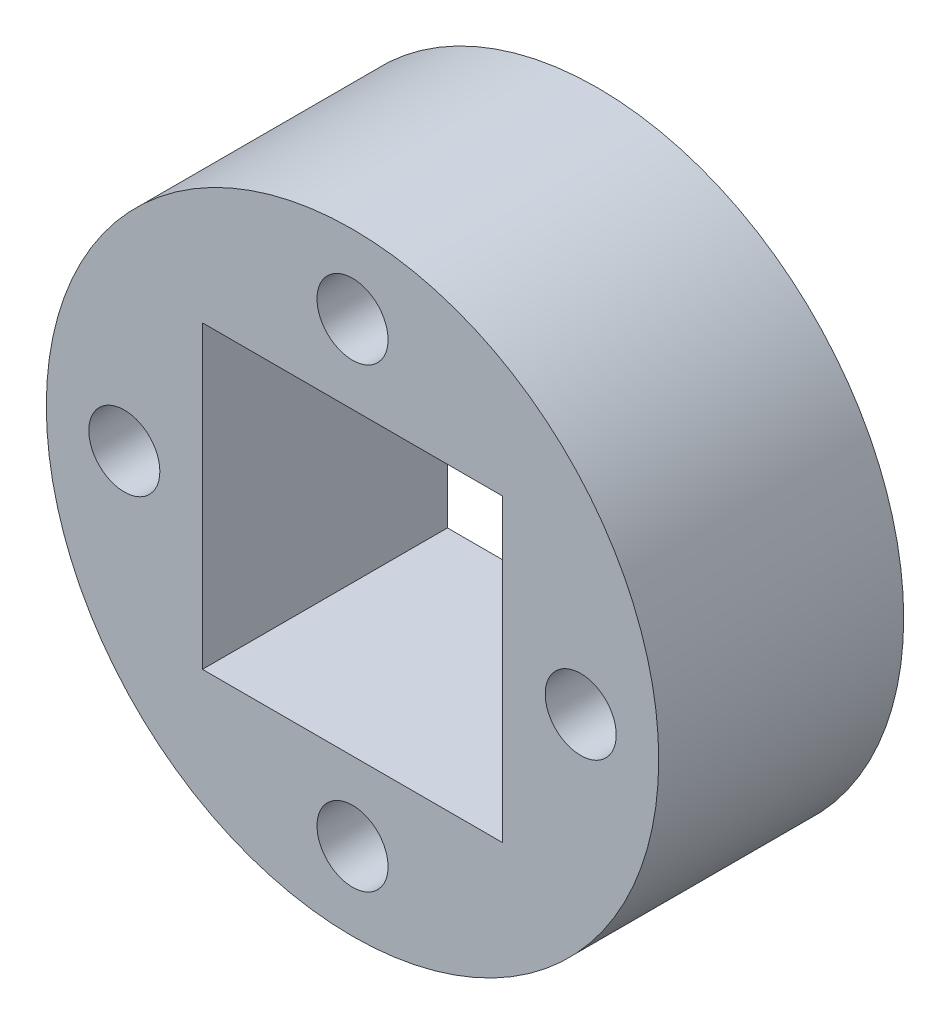
ISO-10303-21;
HEADER;
FILE_DESCRIPTION(('STEP AP214'),'2;1');
FILE_NAME('part.step','',(''),(''),'','','');
FILE_SCHEMA(('AUTOMOTIVE_DESIGN { 1 0 10303 214 1 1 1 1 }'));
ENDSEC;
DATA;
#1=APPLICATION_CONTEXT('core data for automotive mechanical design processes');
#2=APPLICATION_PROTOCOL_DEFINITION('international standard','automotive_design',2000,#1);
#3=PRODUCT_CONTEXT('',#1,'mechanical');
#4=PRODUCT('Part','Part','',(#3));
#5=PRODUCT_RELATED_PRODUCT_CATEGORY('part','',(#4));
#6=PRODUCT_DEFINITION_FORMATION('','',#4);
#7=PRODUCT_DEFINITION_CONTEXT('part definition',#1,'design');
#8=PRODUCT_DEFINITION('design','',#6,#7);
#9=PRODUCT_DEFINITION_SHAPE('','',#8);
#10=(LENGTH_UNIT() NAMED_UNIT(*) SI_UNIT(.MILLI.,.METRE.));
#11=(NAMED_UNIT(*) PLANE_ANGLE_UNIT() SI_UNIT($,.RADIAN.));
#12=(NAMED_UNIT(*) SI_UNIT($,.STERADIAN.) SOLID_ANGLE_UNIT());
#13=UNCERTAINTY_MEASURE_WITH_UNIT(LENGTH_MEASURE(1.E-05),#10,'distance_accuracy_value','');
#14=(GEOMETRIC_REPRESENTATION_CONTEXT(3) GLOBAL_UNCERTAINTY_ASSIGNED_CONTEXT((#13)) GLOBAL_UNIT_ASSIGNED_CONTEXT((#10,
#11,#12)) REPRESENTATION_CONTEXT('',''));
#15=CARTESIAN_POINT('',(0.,0.,0.));
#16=DIRECTION('',(0.,0.,1.));
#17=DIRECTION('',(1.,0.,0.));
#18=AXIS2_PLACEMENT_3D('',#15,#16,#17);
#19=CARTESIAN_POINT('',(0.,0.,-5.));
#20=DIRECTION('',(0.,0.,1.));
#21=DIRECTION('',(-1.,0.,0.));
#22=AXIS2_PLACEMENT_3D('',#19,#20,#21);
#23=CYLINDRICAL_SURFACE('',#22,12.5);
#24=CARTESIAN_POINT('',(0.,0.,-5.));
#25=DIRECTION('',(0.,0.,1.));
#26=DIRECTION('',(1.,0.,0.));
#27=AXIS2_PLACEMENT_3D('',#24,#25,#26);
#28=CIRCLE('',#27,12.5);
#29=CARTESIAN_POINT('',(12.5,0.,-5.));
#30=VERTEX_POINT('',#29);
#31=EDGE_CURVE('E11',#30,#30,#28,.T.);
#32=ORIENTED_EDGE('',*,*,#31,.T.);
#33=EDGE_LOOP('',(#32));
#34=FACE_BOUND('',#33,.T.);
#35=CARTESIAN_POINT('',(0.,0.,5.));
#36=DIRECTION('',(0.,0.,1.));
#37=DIRECTION('',(1.,0.,0.));
#38=AXIS2_PLACEMENT_3D('',#35,#36,#37);
#39=CIRCLE('',#38,12.5);
#40=CARTESIAN_POINT('',(12.5,0.,5.));
#41=VERTEX_POINT('',#40);
#42=EDGE_CURVE('E38',#41,#41,#39,.T.);
#43=ORIENTED_EDGE('',*,*,#42,.F.);
#44=EDGE_LOOP('',(#43));
#45=FACE_BOUND('',#44,.T.);
#46=ADVANCED_FACE('F35',(#34,#45),#23,.T.);
#47=CARTESIAN_POINT('',(0.,0.,-5.));
#48=DIRECTION('',(0.,0.,-1.));
#49=DIRECTION('',(1.,0.,0.));
#50=AXIS2_PLACEMENT_3D('',#47,#48,#49);
#51=PLANE('',#50);
#52=CARTESIAN_POINT('',(9.315,0.,-5.));
#53=DIRECTION('',(0.,0.,1.));
#54=DIRECTION('',(1.,0.,0.));
#55=AXIS2_PLACEMENT_3D('',#52,#53,#54);
#56=CIRCLE('',#55,1.45);
#57=CARTESIAN_POINT('',(10.765,0.,-5.));
#58=VERTEX_POINT('',#57);
#59=EDGE_CURVE('E130',#58,#58,#56,.T.);
#60=ORIENTED_EDGE('',*,*,#59,.T.);
#61=EDGE_LOOP('',(#60));
#62=FACE_BOUND('',#61,.T.);
#63=CARTESIAN_POINT('',(0.,-9.315,-5.));
#64=DIRECTION('',(0.,0.,1.));
#65=DIRECTION('',(1.,0.,0.));
#66=AXIS2_PLACEMENT_3D('',#63,#64,#65);
#67=CIRCLE('',#66,1.45);
#68=CARTESIAN_POINT('',(1.44999999999997,-9.315,-5.));
#69=VERTEX_POINT('',#68);
#70=EDGE_CURVE('E124',#69,#69,#67,.T.);
#71=ORIENTED_EDGE('',*,*,#70,.T.);
#72=EDGE_LOOP('',(#71));
#73=FACE_BOUND('',#72,.T.);
#74=CARTESIAN_POINT('',(-9.315,0.,-5.));
#75=DIRECTION('',(0.,0.,1.));
#76=DIRECTION('',(1.,0.,0.));
#77=AXIS2_PLACEMENT_3D('',#74,#75,#76);
#78=CIRCLE('',#77,1.45);
#79=CARTESIAN_POINT('',(-7.865,0.,-5.));
#80=VERTEX_POINT('',#79);
#81=EDGE_CURVE('E117',#80,#80,#78,.T.);
#82=ORIENTED_EDGE('',*,*,#81,.T.);
#83=EDGE_LOOP('',(#82));
#84=FACE_BOUND('',#83,.T.);
#85=CARTESIAN_POINT('',(0.,9.315,-5.));
#86=DIRECTION('',(0.,0.,1.));
#87=DIRECTION('',(1.,0.,0.));
#88=AXIS2_PLACEMENT_3D('',#85,#86,#87);
#89=CIRCLE('',#88,1.45);
#90=CARTESIAN_POINT('',(1.4500000000001,9.315,-5.));
#91=VERTEX_POINT('',#90);
#92=EDGE_CURVE('E118',#91,#91,#89,.T.);
#93=ORIENTED_EDGE('',*,*,#92,.T.);
#94=EDGE_LOOP('',(#93));
#95=FACE_BOUND('',#94,.T.);
#96=DIRECTION('',(0.,1.,0.));
#97=VECTOR('',#96,1.);
#98=CARTESIAN_POINT('',(6.125,6.125,-5.));
#99=LINE('',#98,#97);
#100=CARTESIAN_POINT('',(6.125,-6.125,-5.));
#101=VERTEX_POINT('',#100);
#102=CARTESIAN_POINT('',(6.125,6.125,-5.));
#103=VERTEX_POINT('',#102);
#104=EDGE_CURVE('E91',#101,#103,#99,.T.);
#105=ORIENTED_EDGE('',*,*,#104,.T.);
#106=DIRECTION('',(-1.,0.,0.));
#107=VECTOR('',#106,1.);
#108=CARTESIAN_POINT('',(-6.125,6.125,-5.));
#109=LINE('',#108,#107);
#110=CARTESIAN_POINT('',(-6.125,6.125,-5.));
#111=VERTEX_POINT('',#110);
#112=EDGE_CURVE('E80',#103,#111,#109,.T.);
#113=ORIENTED_EDGE('',*,*,#112,.T.);
#114=DIRECTION('',(0.,-1.,0.));
#115=VECTOR('',#114,1.);
#116=CARTESIAN_POINT('',(-6.125,6.125,-5.));
#117=LINE('',#116,#115);
#118=CARTESIAN_POINT('',(-6.125,-6.125,-5.));
#119=VERTEX_POINT('',#118);
#120=EDGE_CURVE('E106',#111,#119,#117,.T.);
#121=ORIENTED_EDGE('',*,*,#120,.T.);
#122=DIRECTION('',(1.,0.,0.));
#123=VECTOR('',#122,1.);
#124=CARTESIAN_POINT('',(-6.125,-6.125,-5.));
#125=LINE('',#124,#123);
#126=EDGE_CURVE('E82',#119,#101,#125,.T.);
#127=ORIENTED_EDGE('',*,*,#126,.T.);
#128=EDGE_LOOP('',(#105,#113,#121,#127));
#129=FACE_BOUND('',#128,.T.);
#130=ORIENTED_EDGE('',*,*,#31,.F.);
#131=EDGE_LOOP('',(#130));
#132=FACE_BOUND('',#131,.T.);
#133=ADVANCED_FACE('F138',(#62,#73,#84,#95,#129,#132),#51,.T.);
#134=CARTESIAN_POINT('',(0.,0.,5.));
#135=DIRECTION('',(0.,0.,-1.));
#136=DIRECTION('',(1.,0.,0.));
#137=AXIS2_PLACEMENT_3D('',#134,#135,#136);
#138=PLANE('',#137);
#139=CARTESIAN_POINT('',(9.315,0.,5.));
#140=DIRECTION('',(0.,0.,1.));
#141=DIRECTION('',(1.,0.,0.));
#142=AXIS2_PLACEMENT_3D('',#139,#140,#141);
#143=CIRCLE('',#142,1.45);
#144=CARTESIAN_POINT('',(10.765,0.,5.));
#145=VERTEX_POINT('',#144);
#146=EDGE_CURVE('E113',#145,#145,#143,.F.);
#147=ORIENTED_EDGE('',*,*,#146,.T.);
#148=EDGE_LOOP('',(#147));
#149=FACE_BOUND('',#148,.T.);
#150=CARTESIAN_POINT('',(0.,-9.315,5.));
#151=DIRECTION('',(0.,0.,1.));
#152=DIRECTION('',(1.,0.,0.));
#153=AXIS2_PLACEMENT_3D('',#150,#151,#152);
#154=CIRCLE('',#153,1.45);
#155=CARTESIAN_POINT('',(1.44999999999997,-9.315,5.));
#156=VERTEX_POINT('',#155);
#157=EDGE_CURVE('E127',#156,#156,#154,.F.);
#158=ORIENTED_EDGE('',*,*,#157,.T.);
#159=EDGE_LOOP('',(#158));
#160=FACE_BOUND('',#159,.T.);
#161=CARTESIAN_POINT('',(-9.315,0.,5.));
#162=DIRECTION('',(0.,0.,1.));
#163=DIRECTION('',(1.,0.,0.));
#164=AXIS2_PLACEMENT_3D('',#161,#162,#163);
#165=CIRCLE('',#164,1.45);
#166=CARTESIAN_POINT('',(-7.865,0.,5.));
#167=VERTEX_POINT('',#166);
#168=EDGE_CURVE('E121',#167,#167,#165,.F.);
#169=ORIENTED_EDGE('',*,*,#168,.T.);
#170=EDGE_LOOP('',(#169));
#171=FACE_BOUND('',#170,.T.);
#172=CARTESIAN_POINT('',(0.,9.315,5.));
#173=DIRECTION('',(0.,0.,1.));
#174=DIRECTION('',(1.,0.,0.));
#175=AXIS2_PLACEMENT_3D('',#172,#173,#174);
#176=CIRCLE('',#175,1.45);
#177=CARTESIAN_POINT('',(1.4500000000001,9.315,5.));
#178=VERTEX_POINT('',#177);
#179=EDGE_CURVE('E114',#178,#178,#176,.F.);
#180=ORIENTED_EDGE('',*,*,#179,.T.);
#181=EDGE_LOOP('',(#180));
#182=FACE_BOUND('',#181,.T.);
#183=DIRECTION('',(-1.,0.,0.));
#184=VECTOR('',#183,1.);
#185=CARTESIAN_POINT('',(-6.125,-6.125,5.));
#186=LINE('',#185,#184);
#187=CARTESIAN_POINT('',(6.125,-6.125,5.));
#188=VERTEX_POINT('',#187);
#189=CARTESIAN_POINT('',(-6.125,-6.125,5.));
#190=VERTEX_POINT('',#189);
#191=EDGE_CURVE('E92',#188,#190,#186,.T.);
#192=ORIENTED_EDGE('',*,*,#191,.T.);
#193=DIRECTION('',(0.,1.,0.));
#194=VECTOR('',#193,1.);
#195=CARTESIAN_POINT('',(-6.125,6.125,5.));
#196=LINE('',#195,#194);
#197=CARTESIAN_POINT('',(-6.125,6.125,5.));
#198=VERTEX_POINT('',#197);
#199=EDGE_CURVE('E96',#190,#198,#196,.T.);
#200=ORIENTED_EDGE('',*,*,#199,.T.);
#201=DIRECTION('',(1.,0.,0.));
#202=VECTOR('',#201,1.);
#203=CARTESIAN_POINT('',(-6.125,6.125,5.));
#204=LINE('',#203,#202);
#205=CARTESIAN_POINT('',(6.125,6.125,5.));
#206=VERTEX_POINT('',#205);
#207=EDGE_CURVE('E77',#198,#206,#204,.T.);
#208=ORIENTED_EDGE('',*,*,#207,.T.);
#209=DIRECTION('',(0.,-1.,0.));
#210=VECTOR('',#209,1.);
#211=CARTESIAN_POINT('',(6.125,6.125,5.));
#212=LINE('',#211,#210);
#213=EDGE_CURVE('E85',#206,#188,#212,.T.);
#214=ORIENTED_EDGE('',*,*,#213,.T.);
#215=EDGE_LOOP('',(#192,#200,#208,#214));
#216=FACE_BOUND('',#215,.T.);
#217=ORIENTED_EDGE('',*,*,#42,.T.);
#218=EDGE_LOOP('',(#217));
#219=FACE_BOUND('',#218,.T.);
#220=ADVANCED_FACE('F94',(#149,#160,#171,#182,#216,#219),#138,.F.);
#221=CARTESIAN_POINT('',(6.125,6.125,5.001));
#222=DIRECTION('',(1.,0.,0.));
#223=DIRECTION('',(0.,1.,0.));
#224=AXIS2_PLACEMENT_3D('',#221,#222,#223);
#225=PLANE('',#224);
#226=ORIENTED_EDGE('',*,*,#213,.F.);
#227=DIRECTION('',(0.,0.,-1.));
#228=VECTOR('',#227,1.);
#229=CARTESIAN_POINT('',(6.125,6.125,5.001));
#230=LINE('',#229,#228);
#231=EDGE_CURVE('E49',#206,#103,#230,.T.);
#232=ORIENTED_EDGE('',*,*,#231,.T.);
#233=ORIENTED_EDGE('',*,*,#104,.F.);
#234=DIRECTION('',(0.,0.,-1.));
#235=VECTOR('',#234,1.);
#236=CARTESIAN_POINT('',(6.125,-6.125,5.001));
#237=LINE('',#236,#235);
#238=EDGE_CURVE('E87',#188,#101,#237,.T.);
#239=ORIENTED_EDGE('',*,*,#238,.F.);
#240=EDGE_LOOP('',(#226,#232,#233,#239));
#241=FACE_BOUND('',#240,.T.);
#242=ADVANCED_FACE('F86',(#241),#225,.F.);
#243=CARTESIAN_POINT('',(-6.125,-6.125,5.001));
#244=DIRECTION('',(0.,-1.,0.));
#245=DIRECTION('',(0.,0.,1.));
#246=AXIS2_PLACEMENT_3D('',#243,#244,#245);
#247=PLANE('',#246);
#248=ORIENTED_EDGE('',*,*,#191,.F.);
#249=ORIENTED_EDGE('',*,*,#238,.T.);
#250=ORIENTED_EDGE('',*,*,#126,.F.);
#251=DIRECTION('',(0.,0.,-1.));
#252=VECTOR('',#251,1.);
#253=CARTESIAN_POINT('',(-6.125,-6.125,5.001));
#254=LINE('',#253,#252);
#255=EDGE_CURVE('E99',#190,#119,#254,.T.);
#256=ORIENTED_EDGE('',*,*,#255,.F.);
#257=EDGE_LOOP('',(#248,#249,#250,#256));
#258=FACE_BOUND('',#257,.T.);
#259=ADVANCED_FACE('F185',(#258),#247,.F.);
#260=CARTESIAN_POINT('',(-6.125,6.125,5.001));
#261=DIRECTION('',(-1.,0.,0.));
#262=DIRECTION('',(0.,-1.,0.));
#263=AXIS2_PLACEMENT_3D('',#260,#261,#262);
#264=PLANE('',#263);
#265=ORIENTED_EDGE('',*,*,#199,.F.);
#266=ORIENTED_EDGE('',*,*,#255,.T.);
#267=ORIENTED_EDGE('',*,*,#120,.F.);
#268=DIRECTION('',(0.,0.,-1.));
#269=VECTOR('',#268,1.);
#270=CARTESIAN_POINT('',(-6.125,6.125,5.001));
#271=LINE('',#270,#269);
#272=EDGE_CURVE('E57',#198,#111,#271,.T.);
#273=ORIENTED_EDGE('',*,*,#272,.F.);
#274=EDGE_LOOP('',(#265,#266,#267,#273));
#275=FACE_BOUND('',#274,.T.);
#276=ADVANCED_FACE('F167',(#275),#264,.F.);
#277=CARTESIAN_POINT('',(-6.125,6.125,5.001));
#278=DIRECTION('',(0.,1.,0.));
#279=DIRECTION('',(0.,0.,-1.));
#280=AXIS2_PLACEMENT_3D('',#277,#278,#279);
#281=PLANE('',#280);
#282=ORIENTED_EDGE('',*,*,#207,.F.);
#283=ORIENTED_EDGE('',*,*,#272,.T.);
#284=ORIENTED_EDGE('',*,*,#112,.F.);
#285=ORIENTED_EDGE('',*,*,#231,.F.);
#286=EDGE_LOOP('',(#282,#283,#284,#285));
#287=FACE_BOUND('',#286,.T.);
#288=ADVANCED_FACE('F75',(#287),#281,.F.);
#289=CARTESIAN_POINT('',(0.,9.315,5.001));
#290=DIRECTION('',(0.,0.,-1.));
#291=DIRECTION('',(1.,0.,0.));
#292=AXIS2_PLACEMENT_3D('',#289,#290,#291);
#293=CYLINDRICAL_SURFACE('',#292,1.45);
#294=ORIENTED_EDGE('',*,*,#92,.F.);
#295=EDGE_LOOP('',(#294));
#296=FACE_BOUND('',#295,.T.);
#297=ORIENTED_EDGE('',*,*,#179,.F.);
#298=EDGE_LOOP('',(#297));
#299=FACE_BOUND('',#298,.T.);
#300=ADVANCED_FACE('F156',(#296,#299),#293,.F.);
#301=CARTESIAN_POINT('',(-9.315,0.,5.001));
#302=DIRECTION('',(0.,0.,-1.));
#303=DIRECTION('',(1.,0.,0.));
#304=AXIS2_PLACEMENT_3D('',#301,#302,#303);
#305=CYLINDRICAL_SURFACE('',#304,1.45);
#306=ORIENTED_EDGE('',*,*,#81,.F.);
#307=EDGE_LOOP('',(#306));
#308=FACE_BOUND('',#307,.T.);
#309=ORIENTED_EDGE('',*,*,#168,.F.);
#310=EDGE_LOOP('',(#309));
#311=FACE_BOUND('',#310,.T.);
#312=ADVANCED_FACE('F158',(#308,#311),#305,.F.);
#313=CARTESIAN_POINT('',(0.,-9.315,5.001));
#314=DIRECTION('',(0.,0.,-1.));
#315=DIRECTION('',(1.,0.,0.));
#316=AXIS2_PLACEMENT_3D('',#313,#314,#315);
#317=CYLINDRICAL_SURFACE('',#316,1.45);
#318=ORIENTED_EDGE('',*,*,#70,.F.);
#319=EDGE_LOOP('',(#318));
#320=FACE_BOUND('',#319,.T.);
#321=ORIENTED_EDGE('',*,*,#157,.F.);
#322=EDGE_LOOP('',(#321));
#323=FACE_BOUND('',#322,.T.);
#324=ADVANCED_FACE('F144',(#320,#323),#317,.F.);
#325=CARTESIAN_POINT('',(9.315,0.,5.001));
#326=DIRECTION('',(0.,0.,-1.));
#327=DIRECTION('',(1.,0.,0.));
#328=AXIS2_PLACEMENT_3D('',#325,#326,#327);
#329=CYLINDRICAL_SURFACE('',#328,1.45);
#330=ORIENTED_EDGE('',*,*,#59,.F.);
#331=EDGE_LOOP('',(#330));
#332=FACE_BOUND('',#331,.T.);
#333=ORIENTED_EDGE('',*,*,#146,.F.);
#334=EDGE_LOOP('',(#333));
#335=FACE_BOUND('',#334,.T.);
#336=ADVANCED_FACE('F141',(#332,#335),#329,.F.);
#337=CLOSED_SHELL('',(#46,#133,#220,#242,#259,#276,#288,#300,#312,#324,#336));
#338=MANIFOLD_SOLID_BREP('B2',#337);
#339=ADVANCED_BREP_SHAPE_REPRESENTATION('',(#18,#338),#14);
#340=SHAPE_DEFINITION_REPRESENTATION(#9,#339);
ENDSEC;
END-ISO-10303-21;
